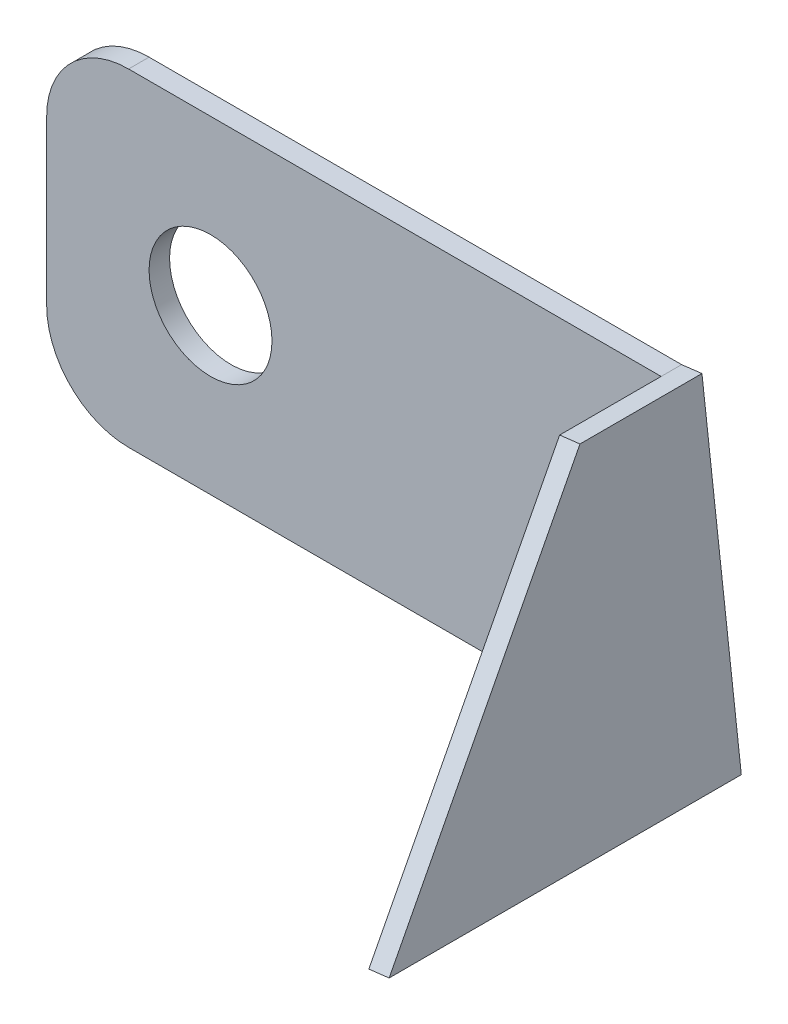
ISO-10303-21;
HEADER;
FILE_DESCRIPTION(('STEP AP214'),'2;1');
FILE_NAME('part.step','',(''),(''),'','','');
FILE_SCHEMA(('AUTOMOTIVE_DESIGN { 1 0 10303 214 1 1 1 1 }'));
ENDSEC;
DATA;
#1=APPLICATION_CONTEXT('core data for automotive mechanical design processes');
#2=APPLICATION_PROTOCOL_DEFINITION('international standard','automotive_design',2000,#1);
#3=PRODUCT_CONTEXT('',#1,'mechanical');
#4=PRODUCT('Part','Part','',(#3));
#5=PRODUCT_RELATED_PRODUCT_CATEGORY('part','',(#4));
#6=PRODUCT_DEFINITION_FORMATION('','',#4);
#7=PRODUCT_DEFINITION_CONTEXT('part definition',#1,'design');
#8=PRODUCT_DEFINITION('design','',#6,#7);
#9=PRODUCT_DEFINITION_SHAPE('','',#8);
#10=(LENGTH_UNIT() NAMED_UNIT(*) SI_UNIT(.MILLI.,.METRE.));
#11=(NAMED_UNIT(*) PLANE_ANGLE_UNIT() SI_UNIT($,.RADIAN.));
#12=(NAMED_UNIT(*) SI_UNIT($,.STERADIAN.) SOLID_ANGLE_UNIT());
#13=UNCERTAINTY_MEASURE_WITH_UNIT(LENGTH_MEASURE(1.E-05),#10,'distance_accuracy_value','');
#14=(GEOMETRIC_REPRESENTATION_CONTEXT(3) GLOBAL_UNCERTAINTY_ASSIGNED_CONTEXT((#13)) GLOBAL_UNIT_ASSIGNED_CONTEXT((#10,
#11,#12)) REPRESENTATION_CONTEXT('',''));
#15=CARTESIAN_POINT('',(0.,0.,0.));
#16=DIRECTION('',(0.,0.,1.));
#17=DIRECTION('',(1.,0.,0.));
#18=AXIS2_PLACEMENT_3D('',#15,#16,#17);
#19=CARTESIAN_POINT('',(34.925,12.7,1.5875));
#20=DIRECTION('',(0.,-1.,0.));
#21=DIRECTION('',(0.,0.,-1.));
#22=AXIS2_PLACEMENT_3D('',#19,#20,#21);
#23=PLANE('',#22);
#24=DIRECTION('',(1.,0.,0.));
#25=VECTOR('',#24,1.);
#26=CARTESIAN_POINT('',(34.925,12.7,1.5875));
#27=LINE('',#26,#25);
#28=CARTESIAN_POINT('',(-6.35000000000001,12.7,1.5875));
#29=VERTEX_POINT('',#28);
#30=CARTESIAN_POINT('',(34.925,12.7,1.5875));
#31=VERTEX_POINT('',#30);
#32=EDGE_CURVE('E147',#29,#31,#27,.T.);
#33=ORIENTED_EDGE('',*,*,#32,.T.);
#34=DIRECTION('',(0.,0.,-1.));
#35=VECTOR('',#34,1.);
#36=CARTESIAN_POINT('',(34.925,12.7,1.5875));
#37=LINE('',#36,#35);
#38=CARTESIAN_POINT('',(34.925,12.7,0.));
#39=VERTEX_POINT('',#38);
#40=EDGE_CURVE('E168',#31,#39,#37,.T.);
#41=ORIENTED_EDGE('',*,*,#40,.T.);
#42=DIRECTION('',(1.,0.,0.));
#43=VECTOR('',#42,1.);
#44=CARTESIAN_POINT('',(34.925,12.7,0.));
#45=LINE('',#44,#43);
#46=CARTESIAN_POINT('',(-6.35000000000001,12.7,0.));
#47=VERTEX_POINT('',#46);
#48=EDGE_CURVE('E133',#47,#39,#45,.T.);
#49=ORIENTED_EDGE('',*,*,#48,.F.);
#50=DIRECTION('',(0.,0.,-1.));
#51=VECTOR('',#50,1.);
#52=CARTESIAN_POINT('',(-6.35000000000001,12.7,1.5875));
#53=LINE('',#52,#51);
#54=EDGE_CURVE('E11',#29,#47,#53,.T.);
#55=ORIENTED_EDGE('',*,*,#54,.F.);
#56=EDGE_LOOP('',(#33,#41,#49,#55));
#57=FACE_BOUND('',#56,.T.);
#58=ADVANCED_FACE('F39',(#57),#23,.F.);
#59=CARTESIAN_POINT('',(34.925,-12.7,1.5875));
#60=DIRECTION('',(0.,1.,0.));
#61=DIRECTION('',(0.,0.,1.));
#62=AXIS2_PLACEMENT_3D('',#59,#60,#61);
#63=PLANE('',#62);
#64=DIRECTION('',(-1.,0.,0.));
#65=VECTOR('',#64,1.);
#66=CARTESIAN_POINT('',(34.925,-12.7,0.));
#67=LINE('',#66,#65);
#68=CARTESIAN_POINT('',(37.976249826367,-12.7,0.));
#69=VERTEX_POINT('',#68);
#70=CARTESIAN_POINT('',(-6.35000000000001,-12.7,0.));
#71=VERTEX_POINT('',#70);
#72=EDGE_CURVE('E162',#69,#71,#67,.T.);
#73=ORIENTED_EDGE('',*,*,#72,.F.);
#74=DIRECTION('',(0.,0.,-1.));
#75=VECTOR('',#74,1.);
#76=CARTESIAN_POINT('',(37.976249826367,-12.7,1.5875));
#77=LINE('',#76,#75);
#78=CARTESIAN_POINT('',(37.976249826367,-12.7,1.5875));
#79=VERTEX_POINT('',#78);
#80=EDGE_CURVE('E160',#79,#69,#77,.T.);
#81=ORIENTED_EDGE('',*,*,#80,.F.);
#82=DIRECTION('',(-1.,0.,0.));
#83=VECTOR('',#82,1.);
#84=CARTESIAN_POINT('',(37.976249826367,-12.7,1.5875));
#85=LINE('',#84,#83);
#86=CARTESIAN_POINT('',(-6.35000000000001,-12.7,1.5875));
#87=VERTEX_POINT('',#86);
#88=EDGE_CURVE('E154',#79,#87,#85,.T.);
#89=ORIENTED_EDGE('',*,*,#88,.T.);
#90=DIRECTION('',(0.,0.,-1.));
#91=VECTOR('',#90,1.);
#92=CARTESIAN_POINT('',(-6.35000000000001,-12.7,1.5875));
#93=LINE('',#92,#91);
#94=EDGE_CURVE('E179',#71,#87,#93,.F.);
#95=ORIENTED_EDGE('',*,*,#94,.F.);
#96=EDGE_LOOP('',(#73,#81,#89,#95));
#97=FACE_BOUND('',#96,.T.);
#98=ADVANCED_FACE('F194',(#97),#63,.F.);
#99=CARTESIAN_POINT('',(-12.7,12.7,1.5875));
#100=DIRECTION('',(1.,0.,0.));
#101=DIRECTION('',(0.,0.,1.));
#102=AXIS2_PLACEMENT_3D('',#99,#100,#101);
#103=PLANE('',#102);
#104=DIRECTION('',(0.,1.,0.));
#105=VECTOR('',#104,1.);
#106=CARTESIAN_POINT('',(-12.7,12.7,1.5875));
#107=LINE('',#106,#105);
#108=CARTESIAN_POINT('',(-12.7,-6.35,1.5875));
#109=VERTEX_POINT('',#108);
#110=CARTESIAN_POINT('',(-12.7,6.35,1.5875));
#111=VERTEX_POINT('',#110);
#112=EDGE_CURVE('E157',#109,#111,#107,.T.);
#113=ORIENTED_EDGE('',*,*,#112,.T.);
#114=DIRECTION('',(0.,0.,-1.));
#115=VECTOR('',#114,1.);
#116=CARTESIAN_POINT('',(-12.7,6.35,1.5875));
#117=LINE('',#116,#115);
#118=CARTESIAN_POINT('',(-12.7,6.35,0.));
#119=VERTEX_POINT('',#118);
#120=EDGE_CURVE('E170',#119,#111,#117,.F.);
#121=ORIENTED_EDGE('',*,*,#120,.F.);
#122=DIRECTION('',(0.,1.,0.));
#123=VECTOR('',#122,1.);
#124=CARTESIAN_POINT('',(-12.7,12.7,0.));
#125=LINE('',#124,#123);
#126=CARTESIAN_POINT('',(-12.7,-6.35,0.));
#127=VERTEX_POINT('',#126);
#128=EDGE_CURVE('E151',#127,#119,#125,.T.);
#129=ORIENTED_EDGE('',*,*,#128,.F.);
#130=DIRECTION('',(0.,0.,-1.));
#131=VECTOR('',#130,1.);
#132=CARTESIAN_POINT('',(-12.7,-6.35,1.5875));
#133=LINE('',#132,#131);
#134=EDGE_CURVE('E172',#109,#127,#133,.T.);
#135=ORIENTED_EDGE('',*,*,#134,.F.);
#136=EDGE_LOOP('',(#113,#121,#129,#135));
#137=FACE_BOUND('',#136,.T.);
#138=ADVANCED_FACE('F187',(#137),#103,.F.);
#139=CARTESIAN_POINT('',(34.925,0.,1.5875));
#140=DIRECTION('',(0.,0.,-1.));
#141=DIRECTION('',(1.,0.,0.));
#142=AXIS2_PLACEMENT_3D('',#139,#140,#141);
#143=PLANE('',#142);
#144=CARTESIAN_POINT('',(0.,0.,1.5875));
#145=DIRECTION('',(0.,0.,1.));
#146=DIRECTION('',(1.,0.,0.));
#147=AXIS2_PLACEMENT_3D('',#144,#145,#146);
#148=CIRCLE('',#147,4.7625);
#149=CARTESIAN_POINT('',(4.7625,0.,1.5875));
#150=VERTEX_POINT('',#149);
#151=EDGE_CURVE('E139',#150,#150,#148,.T.);
#152=ORIENTED_EDGE('',*,*,#151,.F.);
#153=EDGE_LOOP('',(#152));
#154=FACE_BOUND('',#153,.T.);
#155=ORIENTED_EDGE('',*,*,#88,.F.);
#156=DIRECTION('',(0.119270448985395,-0.992861803071718,0.));
#157=VECTOR('',#156,1.);
#158=CARTESIAN_POINT('',(34.925,12.7,1.5875));
#159=LINE('',#158,#157);
#160=EDGE_CURVE('E150',#31,#79,#159,.T.);
#161=ORIENTED_EDGE('',*,*,#160,.F.);
#162=ORIENTED_EDGE('',*,*,#32,.F.);
#163=CARTESIAN_POINT('',(-6.35000000000001,6.35,1.5875));
#164=DIRECTION('',(0.,0.,1.));
#165=DIRECTION('',(1.,0.,0.));
#166=AXIS2_PLACEMENT_3D('',#163,#164,#165);
#167=CIRCLE('',#166,6.35);
#168=EDGE_CURVE('E53',#111,#29,#167,.F.);
#169=ORIENTED_EDGE('',*,*,#168,.F.);
#170=ORIENTED_EDGE('',*,*,#112,.F.);
#171=CARTESIAN_POINT('',(-6.35000000000001,-6.35,1.5875));
#172=DIRECTION('',(0.,0.,1.));
#173=DIRECTION('',(1.,0.,0.));
#174=AXIS2_PLACEMENT_3D('',#171,#172,#173);
#175=CIRCLE('',#174,6.35);
#176=EDGE_CURVE('E47',#87,#109,#175,.F.);
#177=ORIENTED_EDGE('',*,*,#176,.F.);
#178=EDGE_LOOP('',(#155,#161,#162,#169,#170,#177));
#179=FACE_BOUND('',#178,.T.);
#180=ADVANCED_FACE('F189',(#154,#179),#143,.F.);
#181=CARTESIAN_POINT('',(34.925,0.,0.));
#182=DIRECTION('',(0.,0.,-1.));
#183=DIRECTION('',(1.,0.,0.));
#184=AXIS2_PLACEMENT_3D('',#181,#182,#183);
#185=PLANE('',#184);
#186=CARTESIAN_POINT('',(0.,0.,0.));
#187=DIRECTION('',(0.,0.,-1.));
#188=DIRECTION('',(-1.,0.,0.));
#189=AXIS2_PLACEMENT_3D('',#186,#187,#188);
#190=CIRCLE('',#189,4.7625);
#191=CARTESIAN_POINT('',(-4.7625,0.,0.));
#192=VERTEX_POINT('',#191);
#193=EDGE_CURVE('E135',#192,#192,#190,.T.);
#194=ORIENTED_EDGE('',*,*,#193,.F.);
#195=EDGE_LOOP('',(#194));
#196=FACE_BOUND('',#195,.T.);
#197=ORIENTED_EDGE('',*,*,#128,.T.);
#198=CARTESIAN_POINT('',(-6.35000000000001,6.35,0.));
#199=DIRECTION('',(0.,0.,1.));
#200=DIRECTION('',(1.,0.,0.));
#201=AXIS2_PLACEMENT_3D('',#198,#199,#200);
#202=CIRCLE('',#201,6.35);
#203=EDGE_CURVE('E175',#47,#119,#202,.T.);
#204=ORIENTED_EDGE('',*,*,#203,.F.);
#205=ORIENTED_EDGE('',*,*,#48,.T.);
#206=DIRECTION('',(-0.992861803071718,-0.119270448985395,0.));
#207=VECTOR('',#206,1.);
#208=CARTESIAN_POINT('',(36.5011681123763,12.8893418377643,0.));
#209=LINE('',#208,#207);
#210=CARTESIAN_POINT('',(36.5011681123763,12.8893418377643,0.));
#211=VERTEX_POINT('',#210);
#212=EDGE_CURVE('E116',#211,#39,#209,.T.);
#213=ORIENTED_EDGE('',*,*,#212,.F.);
#214=DIRECTION('',(0.119270448985395,-0.992861803071718,0.));
#215=VECTOR('',#214,1.);
#216=CARTESIAN_POINT('',(36.5011681123763,12.8893418377643,0.));
#217=LINE('',#216,#215);
#218=CARTESIAN_POINT('',(39.5524179387434,-12.5106581622357,0.));
#219=VERTEX_POINT('',#218);
#220=EDGE_CURVE('E120',#211,#219,#217,.T.);
#221=ORIENTED_EDGE('',*,*,#220,.T.);
#222=DIRECTION('',(-0.992861803071718,-0.119270448985395,0.));
#223=VECTOR('',#222,1.);
#224=CARTESIAN_POINT('',(39.5524179387434,-12.5106581622357,0.));
#225=LINE('',#224,#223);
#226=EDGE_CURVE('E136',#219,#69,#225,.T.);
#227=ORIENTED_EDGE('',*,*,#226,.T.);
#228=ORIENTED_EDGE('',*,*,#72,.T.);
#229=CARTESIAN_POINT('',(-6.35000000000001,-6.35,0.));
#230=DIRECTION('',(0.,0.,1.));
#231=DIRECTION('',(1.,0.,0.));
#232=AXIS2_PLACEMENT_3D('',#229,#230,#231);
#233=CIRCLE('',#232,6.35);
#234=EDGE_CURVE('E177',#127,#71,#233,.T.);
#235=ORIENTED_EDGE('',*,*,#234,.F.);
#236=EDGE_LOOP('',(#197,#204,#205,#213,#221,#227,#228,#235));
#237=FACE_BOUND('',#236,.T.);
#238=ADVANCED_FACE('F131',(#196,#237),#185,.T.);
#239=CARTESIAN_POINT('',(0.,0.,0.));
#240=DIRECTION('',(0.,0.,1.));
#241=DIRECTION('',(-1.,0.,0.));
#242=AXIS2_PLACEMENT_3D('',#239,#240,#241);
#243=CYLINDRICAL_SURFACE('',#242,4.7625);
#244=ORIENTED_EDGE('',*,*,#193,.T.);
#245=EDGE_LOOP('',(#244));
#246=FACE_BOUND('',#245,.T.);
#247=ORIENTED_EDGE('',*,*,#151,.T.);
#248=EDGE_LOOP('',(#247));
#249=FACE_BOUND('',#248,.T.);
#250=ADVANCED_FACE('F224',(#246,#249),#243,.F.);
#251=CARTESIAN_POINT('',(36.4289222275167,0.180663088014956,0.));
#252=DIRECTION('',(-0.992861803071718,-0.119270448985395,0.));
#253=DIRECTION('',(-0.119270448985395,0.992861803071718,0.));
#254=AXIS2_PLACEMENT_3D('',#251,#252,#253);
#255=PLANE('',#254);
#256=ORIENTED_EDGE('',*,*,#160,.T.);
#257=DIRECTION('',(0.,0.,1.));
#258=VECTOR('',#257,1.);
#259=CARTESIAN_POINT('',(37.976249826367,-12.7,0.));
#260=LINE('',#259,#258);
#261=CARTESIAN_POINT('',(37.976249826367,-12.7,27.2953089126241));
#262=VERTEX_POINT('',#261);
#263=EDGE_CURVE('E321',#79,#262,#260,.T.);
#264=ORIENTED_EDGE('',*,*,#263,.T.);
#265=DIRECTION('',(-0.0978291419740346,0.81437455060803,-0.572034570898117));
#266=VECTOR('',#265,1.);
#267=CARTESIAN_POINT('',(34.925,12.7,9.45379103861392));
#268=LINE('',#267,#266);
#269=CARTESIAN_POINT('',(34.925,12.7,9.45379103861392));
#270=VERTEX_POINT('',#269);
#271=EDGE_CURVE('E121',#262,#270,#268,.T.);
#272=ORIENTED_EDGE('',*,*,#271,.T.);
#273=DIRECTION('',(0.,0.,-1.));
#274=VECTOR('',#273,1.);
#275=CARTESIAN_POINT('',(34.925,12.7,0.));
#276=LINE('',#275,#274);
#277=EDGE_CURVE('E198',#270,#31,#276,.T.);
#278=ORIENTED_EDGE('',*,*,#277,.T.);
#279=EDGE_LOOP('',(#256,#264,#272,#278));
#280=FACE_BOUND('',#279,.T.);
#281=ADVANCED_FACE('F222',(#280),#255,.T.);
#282=CARTESIAN_POINT('',(36.5011681123763,12.8893418377643,0.));
#283=DIRECTION('',(0.119270448985395,-0.992861803071718,0.));
#284=DIRECTION('',(-0.992861803071718,-0.119270448985395,0.));
#285=AXIS2_PLACEMENT_3D('',#282,#283,#284);
#286=PLANE('',#285);
#287=ORIENTED_EDGE('',*,*,#277,.F.);
#288=DIRECTION('',(-0.992861803071718,-0.119270448985395,0.));
#289=VECTOR('',#288,1.);
#290=CARTESIAN_POINT('',(36.5011681123763,12.8893418377643,9.45379103861392));
#291=LINE('',#290,#289);
#292=CARTESIAN_POINT('',(36.5011681123763,12.8893418377643,9.45379103861392));
#293=VERTEX_POINT('',#292);
#294=EDGE_CURVE('E118',#293,#270,#291,.T.);
#295=ORIENTED_EDGE('',*,*,#294,.F.);
#296=DIRECTION('',(0.,0.,-1.));
#297=VECTOR('',#296,1.);
#298=CARTESIAN_POINT('',(36.5011681123763,12.8893418377643,0.));
#299=LINE('',#298,#297);
#300=EDGE_CURVE('E110',#293,#211,#299,.T.);
#301=ORIENTED_EDGE('',*,*,#300,.T.);
#302=ORIENTED_EDGE('',*,*,#212,.T.);
#303=ORIENTED_EDGE('',*,*,#40,.F.);
#304=EDGE_LOOP('',(#287,#295,#301,#302,#303));
#305=FACE_BOUND('',#304,.T.);
#306=ADVANCED_FACE('F113',(#305),#286,.F.);
#307=CARTESIAN_POINT('',(39.5524179387434,-12.5106581622357,0.));
#308=DIRECTION('',(-0.119270448985395,0.992861803071718,0.));
#309=DIRECTION('',(0.992861803071718,0.119270448985395,0.));
#310=AXIS2_PLACEMENT_3D('',#307,#308,#309);
#311=PLANE('',#310);
#312=ORIENTED_EDGE('',*,*,#80,.T.);
#313=ORIENTED_EDGE('',*,*,#226,.F.);
#314=DIRECTION('',(0.,0.,1.));
#315=VECTOR('',#314,1.);
#316=CARTESIAN_POINT('',(39.5524179387434,-12.5106581622357,0.));
#317=LINE('',#316,#315);
#318=CARTESIAN_POINT('',(39.5524179387434,-12.5106581622357,27.2953089126241));
#319=VERTEX_POINT('',#318);
#320=EDGE_CURVE('E126',#219,#319,#317,.T.);
#321=ORIENTED_EDGE('',*,*,#320,.T.);
#322=DIRECTION('',(-0.992861803071718,-0.119270448985395,0.));
#323=VECTOR('',#322,1.);
#324=CARTESIAN_POINT('',(39.5524179387434,-12.5106581622357,27.2953089126241));
#325=LINE('',#324,#323);
#326=EDGE_CURVE('E141',#319,#262,#325,.T.);
#327=ORIENTED_EDGE('',*,*,#326,.T.);
#328=ORIENTED_EDGE('',*,*,#263,.F.);
#329=EDGE_LOOP('',(#312,#313,#321,#327,#328));
#330=FACE_BOUND('',#329,.T.);
#331=ADVANCED_FACE('F218',(#330),#311,.F.);
#332=CARTESIAN_POINT('',(36.5011681123763,12.8893418377643,9.45379103861392));
#333=DIRECTION('',(0.0682268201061862,-0.567951275481261,-0.820229510379508));
#334=DIRECTION('',(0.,0.822145243895806,-0.569277786269151));
#335=AXIS2_PLACEMENT_3D('',#332,#333,#334);
#336=PLANE('',#335);
#337=ORIENTED_EDGE('',*,*,#271,.F.);
#338=ORIENTED_EDGE('',*,*,#326,.F.);
#339=DIRECTION('',(-0.0978291419740346,0.81437455060803,-0.572034570898117));
#340=VECTOR('',#339,1.);
#341=CARTESIAN_POINT('',(36.5011681123763,12.8893418377643,9.45379103861392));
#342=LINE('',#341,#340);
#343=EDGE_CURVE('E329',#319,#293,#342,.T.);
#344=ORIENTED_EDGE('',*,*,#343,.T.);
#345=ORIENTED_EDGE('',*,*,#294,.T.);
#346=EDGE_LOOP('',(#337,#338,#344,#345));
#347=FACE_BOUND('',#346,.T.);
#348=ADVANCED_FACE('F213',(#347),#336,.F.);
#349=CARTESIAN_POINT('',(38.0050903398931,0.370004925779271,0.));
#350=DIRECTION('',(-0.992861803071718,-0.119270448985395,0.));
#351=DIRECTION('',(-0.119270448985395,0.992861803071718,0.));
#352=AXIS2_PLACEMENT_3D('',#349,#350,#351);
#353=PLANE('',#352);
#354=ORIENTED_EDGE('',*,*,#300,.F.);
#355=ORIENTED_EDGE('',*,*,#343,.F.);
#356=ORIENTED_EDGE('',*,*,#320,.F.);
#357=ORIENTED_EDGE('',*,*,#220,.F.);
#358=EDGE_LOOP('',(#354,#355,#356,#357));
#359=FACE_BOUND('',#358,.T.);
#360=ADVANCED_FACE('F124',(#359),#353,.F.);
#361=CARTESIAN_POINT('',(-6.35000000000001,-6.35,1.5875));
#362=DIRECTION('',(0.,0.,-1.));
#363=DIRECTION('',(1.,0.,0.));
#364=AXIS2_PLACEMENT_3D('',#361,#362,#363);
#365=CYLINDRICAL_SURFACE('',#364,6.35);
#366=ORIENTED_EDGE('',*,*,#176,.T.);
#367=ORIENTED_EDGE('',*,*,#134,.T.);
#368=ORIENTED_EDGE('',*,*,#234,.T.);
#369=ORIENTED_EDGE('',*,*,#94,.T.);
#370=EDGE_LOOP('',(#366,#367,#368,#369));
#371=FACE_BOUND('',#370,.T.);
#372=ADVANCED_FACE('F183',(#371),#365,.T.);
#373=CARTESIAN_POINT('',(-6.35000000000001,6.35,1.5875));
#374=DIRECTION('',(0.,0.,-1.));
#375=DIRECTION('',(1.,0.,0.));
#376=AXIS2_PLACEMENT_3D('',#373,#374,#375);
#377=CYLINDRICAL_SURFACE('',#376,6.35);
#378=ORIENTED_EDGE('',*,*,#168,.T.);
#379=ORIENTED_EDGE('',*,*,#54,.T.);
#380=ORIENTED_EDGE('',*,*,#203,.T.);
#381=ORIENTED_EDGE('',*,*,#120,.T.);
#382=EDGE_LOOP('',(#378,#379,#380,#381));
#383=FACE_BOUND('',#382,.T.);
#384=ADVANCED_FACE('F41',(#383),#377,.T.);
#385=CLOSED_SHELL('',(#58,#98,#138,#180,#238,#250,#281,#306,#331,#348,#360,#372,#384));
#386=MANIFOLD_SOLID_BREP('B2',#385);
#387=ADVANCED_BREP_SHAPE_REPRESENTATION('',(#18,#386),#14);
#388=SHAPE_DEFINITION_REPRESENTATION(#9,#387);
ENDSEC;
END-ISO-10303-21;
